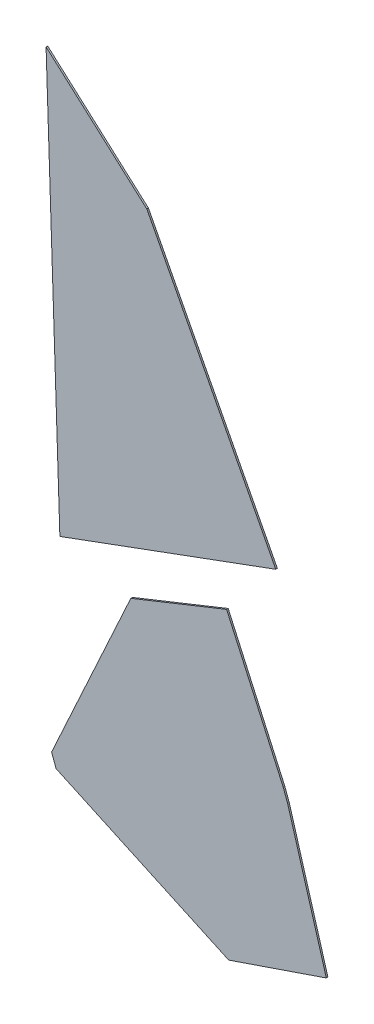
ISO-10303-21;
HEADER;
FILE_DESCRIPTION(('STEP AP214'),'2;1');
FILE_NAME('part.step','',(''),(''),'','','');
FILE_SCHEMA(('AUTOMOTIVE_DESIGN { 1 0 10303 214 1 1 1 1 }'));
ENDSEC;
DATA;
#1=APPLICATION_CONTEXT('core data for automotive mechanical design processes');
#2=APPLICATION_PROTOCOL_DEFINITION('international standard','automotive_design',2000,#1);
#3=PRODUCT_CONTEXT('',#1,'mechanical');
#4=PRODUCT('Part','Part','',(#3));
#5=PRODUCT_RELATED_PRODUCT_CATEGORY('part','',(#4));
#6=PRODUCT_DEFINITION_FORMATION('','',#4);
#7=PRODUCT_DEFINITION_CONTEXT('part definition',#1,'design');
#8=PRODUCT_DEFINITION('design','',#6,#7);
#9=PRODUCT_DEFINITION_SHAPE('','',#8);
#10=(LENGTH_UNIT() NAMED_UNIT(*) SI_UNIT(.MILLI.,.METRE.));
#11=(NAMED_UNIT(*) PLANE_ANGLE_UNIT() SI_UNIT($,.RADIAN.));
#12=(NAMED_UNIT(*) SI_UNIT($,.STERADIAN.) SOLID_ANGLE_UNIT());
#13=UNCERTAINTY_MEASURE_WITH_UNIT(LENGTH_MEASURE(1.E-05),#10,'distance_accuracy_value','');
#14=(GEOMETRIC_REPRESENTATION_CONTEXT(3) GLOBAL_UNCERTAINTY_ASSIGNED_CONTEXT((#13)) GLOBAL_UNIT_ASSIGNED_CONTEXT((#10,
#11,#12)) REPRESENTATION_CONTEXT('',''));
#15=CARTESIAN_POINT('',(0.,0.,0.));
#16=DIRECTION('',(0.,0.,1.));
#17=DIRECTION('',(1.,0.,0.));
#18=AXIS2_PLACEMENT_3D('',#15,#16,#17);
#19=CARTESIAN_POINT('',(35.348767398659,13.6278782738416,0.25));
#20=DIRECTION('',(0.908950021789719,-0.416905094582053,0.));
#21=DIRECTION('',(0.416905094582053,0.908950021789719,0.));
#22=AXIS2_PLACEMENT_3D('',#19,#20,#21);
#23=PLANE('',#22);
#24=DIRECTION('',(-0.416905094582053,-0.908950021789719,0.));
#25=VECTOR('',#24,1.);
#26=CARTESIAN_POINT('',(35.348767398659,13.6278782738416,0.));
#27=LINE('',#26,#25);
#28=CARTESIAN_POINT('',(35.348767398659,13.6278782738416,0.));
#29=VERTEX_POINT('',#28);
#30=CARTESIAN_POINT('',(23.1074874674025,-13.0609576383319,0.));
#31=VERTEX_POINT('',#30);
#32=EDGE_CURVE('E127',#29,#31,#27,.T.);
#33=ORIENTED_EDGE('',*,*,#32,.T.);
#34=DIRECTION('',(0.,0.,-1.));
#35=VECTOR('',#34,1.);
#36=CARTESIAN_POINT('',(23.1074874674025,-13.0609576383319,0.25));
#37=LINE('',#36,#35);
#38=CARTESIAN_POINT('',(23.1074874674025,-13.0609576383319,0.25));
#39=VERTEX_POINT('',#38);
#40=EDGE_CURVE('E12',#39,#31,#37,.T.);
#41=ORIENTED_EDGE('',*,*,#40,.F.);
#42=DIRECTION('',(-0.416905094582053,-0.908950021789719,0.));
#43=VECTOR('',#42,1.);
#44=CARTESIAN_POINT('',(35.348767398659,13.6278782738416,0.25));
#45=LINE('',#44,#43);
#46=CARTESIAN_POINT('',(35.348767398659,13.6278782738416,0.25));
#47=VERTEX_POINT('',#46);
#48=EDGE_CURVE('E89',#47,#39,#45,.T.);
#49=ORIENTED_EDGE('',*,*,#48,.F.);
#50=DIRECTION('',(0.,0.,-1.));
#51=VECTOR('',#50,1.);
#52=CARTESIAN_POINT('',(35.348767398659,13.6278782738416,0.25));
#53=LINE('',#52,#51);
#54=EDGE_CURVE('E168',#47,#29,#53,.T.);
#55=ORIENTED_EDGE('',*,*,#54,.T.);
#56=EDGE_LOOP('',(#33,#41,#49,#55));
#57=FACE_BOUND('',#56,.T.);
#58=ADVANCED_FACE('F47',(#57),#23,.F.);
#59=CARTESIAN_POINT('',(58.8762130793642,0.181757912814679,0.25));
#60=DIRECTION('',(-0.911627072645845,-0.411018345599277,0.));
#61=DIRECTION('',(0.411018345599277,-0.911627072645845,0.));
#62=AXIS2_PLACEMENT_3D('',#59,#60,#61);
#63=PLANE('',#62);
#64=DIRECTION('',(-0.411018345599277,0.911627072645845,0.));
#65=VECTOR('',#64,1.);
#66=CARTESIAN_POINT('',(58.8762130793642,0.181757912814679,0.));
#67=LINE('',#66,#65);
#68=CARTESIAN_POINT('',(58.8762130793642,0.181757912814679,0.));
#69=VERTEX_POINT('',#68);
#70=CARTESIAN_POINT('',(50.1461458372713,19.5448002906597,0.));
#71=VERTEX_POINT('',#70);
#72=EDGE_CURVE('E78',#69,#71,#67,.T.);
#73=ORIENTED_EDGE('',*,*,#72,.T.);
#74=DIRECTION('',(0.,0.,-1.));
#75=VECTOR('',#74,1.);
#76=CARTESIAN_POINT('',(50.1461458372713,19.5448002906597,0.25));
#77=LINE('',#76,#75);
#78=CARTESIAN_POINT('',(50.1461458372713,19.5448002906597,0.25));
#79=VERTEX_POINT('',#78);
#80=EDGE_CURVE('E173',#79,#71,#77,.T.);
#81=ORIENTED_EDGE('',*,*,#80,.F.);
#82=DIRECTION('',(-0.411018345599277,0.911627072645845,0.));
#83=VECTOR('',#82,1.);
#84=CARTESIAN_POINT('',(58.8762130793642,0.181757912814679,0.25));
#85=LINE('',#84,#83);
#86=CARTESIAN_POINT('',(58.8762130793642,0.181757912814679,0.25));
#87=VERTEX_POINT('',#86);
#88=EDGE_CURVE('E165',#87,#79,#85,.T.);
#89=ORIENTED_EDGE('',*,*,#88,.F.);
#90=DIRECTION('',(0.,0.,-1.));
#91=VECTOR('',#90,1.);
#92=CARTESIAN_POINT('',(58.8762130793642,0.181757912814679,0.25));
#93=LINE('',#92,#91);
#94=EDGE_CURVE('E55',#87,#69,#93,.T.);
#95=ORIENTED_EDGE('',*,*,#94,.T.);
#96=EDGE_LOOP('',(#73,#81,#89,#95));
#97=FACE_BOUND('',#96,.T.);
#98=ADVANCED_FACE('F174',(#97),#63,.F.);
#99=CARTESIAN_POINT('',(35.348767398659,13.6278782738416,0.25));
#100=DIRECTION('',(0.371280897715098,-0.928520594812991,0.));
#101=DIRECTION('',(0.928520594812991,0.371280897715098,0.));
#102=AXIS2_PLACEMENT_3D('',#99,#100,#101);
#103=PLANE('',#102);
#104=DIRECTION('',(-0.928520594812991,-0.371280897715098,0.));
#105=VECTOR('',#104,1.);
#106=CARTESIAN_POINT('',(35.348767398659,13.6278782738416,0.));
#107=LINE('',#106,#105);
#108=EDGE_CURVE('E84',#71,#29,#107,.T.);
#109=ORIENTED_EDGE('',*,*,#108,.T.);
#110=ORIENTED_EDGE('',*,*,#54,.F.);
#111=DIRECTION('',(-0.928520594812991,-0.371280897715098,0.));
#112=VECTOR('',#111,1.);
#113=CARTESIAN_POINT('',(35.348767398659,13.6278782738416,0.25));
#114=LINE('',#113,#112);
#115=EDGE_CURVE('E63',#79,#47,#114,.T.);
#116=ORIENTED_EDGE('',*,*,#115,.F.);
#117=ORIENTED_EDGE('',*,*,#80,.T.);
#118=EDGE_LOOP('',(#109,#110,#116,#117));
#119=FACE_BOUND('',#118,.T.);
#120=ADVANCED_FACE('F203',(#119),#103,.F.);
#121=CARTESIAN_POINT('',(0.,0.,0.25));
#122=DIRECTION('',(0.,0.,-1.));
#123=DIRECTION('',(-1.,0.,0.));
#124=AXIS2_PLACEMENT_3D('',#121,#122,#123);
#125=PLANE('',#124);
#126=ORIENTED_EDGE('',*,*,#48,.T.);
#127=DIRECTION('',(0.347199983804975,-0.937791112799554,0.));
#128=VECTOR('',#127,1.);
#129=CARTESIAN_POINT('',(23.1074874674025,-13.0609576383319,0.25));
#130=LINE('',#129,#128);
#131=CARTESIAN_POINT('',(23.8018874350125,-14.936539863931,0.25));
#132=VERTEX_POINT('',#131);
#133=EDGE_CURVE('E160',#39,#132,#130,.T.);
#134=ORIENTED_EDGE('',*,*,#133,.T.);
#135=DIRECTION('',(-0.9083012663516,0.418316637900143,0.));
#136=VECTOR('',#135,1.);
#137=CARTESIAN_POINT('',(50.4716744148795,-27.2192659111414,0.25));
#138=LINE('',#137,#136);
#139=CARTESIAN_POINT('',(50.4716744148795,-27.2192659111414,0.25));
#140=VERTEX_POINT('',#139);
#141=EDGE_CURVE('E147',#140,#132,#138,.T.);
#142=ORIENTED_EDGE('',*,*,#141,.F.);
#143=DIRECTION('',(-0.94643721859255,-0.322887892716339,0.));
#144=VECTOR('',#143,1.);
#145=CARTESIAN_POINT('',(50.4716744148795,-27.2192659111414,0.25));
#146=LINE('',#145,#144);
#147=CARTESIAN_POINT('',(65.5545813209156,-22.073559538595,0.25));
#148=VERTEX_POINT('',#147);
#149=EDGE_CURVE('E156',#148,#140,#146,.T.);
#150=ORIENTED_EDGE('',*,*,#149,.F.);
#151=DIRECTION('',(0.281729873535813,-0.95949376150004,0.));
#152=VECTOR('',#151,1.);
#153=CARTESIAN_POINT('',(59.5706130469742,-1.69382431278441,0.25));
#154=LINE('',#153,#152);
#155=CARTESIAN_POINT('',(59.5706130469742,-1.69382431278441,0.25));
#156=VERTEX_POINT('',#155);
#157=EDGE_CURVE('E176',#156,#148,#154,.T.);
#158=ORIENTED_EDGE('',*,*,#157,.F.);
#159=DIRECTION('',(-0.347199983804977,0.937791112799553,0.));
#160=VECTOR('',#159,1.);
#161=CARTESIAN_POINT('',(59.2234130631692,-0.756033199984865,0.25));
#162=LINE('',#161,#160);
#163=EDGE_CURVE('E134',#156,#87,#162,.T.);
#164=ORIENTED_EDGE('',*,*,#163,.T.);
#165=ORIENTED_EDGE('',*,*,#88,.T.);
#166=ORIENTED_EDGE('',*,*,#115,.T.);
#167=EDGE_LOOP('',(#126,#134,#142,#150,#158,#164,#165,#166));
#168=FACE_BOUND('',#167,.T.);
#169=ADVANCED_FACE('F175',(#168),#125,.F.);
#170=CARTESIAN_POINT('',(0.,0.,0.));
#171=DIRECTION('',(0.,0.,-1.));
#172=DIRECTION('',(-1.,0.,0.));
#173=AXIS2_PLACEMENT_3D('',#170,#171,#172);
#174=PLANE('',#173);
#175=ORIENTED_EDGE('',*,*,#32,.F.);
#176=ORIENTED_EDGE('',*,*,#108,.F.);
#177=ORIENTED_EDGE('',*,*,#72,.F.);
#178=DIRECTION('',(-0.347199983804978,0.937791112799553,0.));
#179=VECTOR('',#178,1.);
#180=CARTESIAN_POINT('',(59.2234130631692,-0.756033199984865,0.));
#181=LINE('',#180,#179);
#182=CARTESIAN_POINT('',(59.5706130469742,-1.69382431278441,0.));
#183=VERTEX_POINT('',#182);
#184=EDGE_CURVE('E119',#183,#69,#181,.T.);
#185=ORIENTED_EDGE('',*,*,#184,.F.);
#186=DIRECTION('',(0.281729873535813,-0.95949376150004,0.));
#187=VECTOR('',#186,1.);
#188=CARTESIAN_POINT('',(59.5706130469742,-1.69382431278441,0.));
#189=LINE('',#188,#187);
#190=CARTESIAN_POINT('',(65.5545813209156,-22.073559538595,0.));
#191=VERTEX_POINT('',#190);
#192=EDGE_CURVE('E124',#183,#191,#189,.T.);
#193=ORIENTED_EDGE('',*,*,#192,.T.);
#194=DIRECTION('',(-0.94643721859255,-0.322887892716339,0.));
#195=VECTOR('',#194,1.);
#196=CARTESIAN_POINT('',(50.4716744148795,-27.2192659111414,0.));
#197=LINE('',#196,#195);
#198=CARTESIAN_POINT('',(50.4716744148795,-27.2192659111414,0.));
#199=VERTEX_POINT('',#198);
#200=EDGE_CURVE('E144',#191,#199,#197,.T.);
#201=ORIENTED_EDGE('',*,*,#200,.T.);
#202=DIRECTION('',(-0.9083012663516,0.418316637900143,0.));
#203=VECTOR('',#202,1.);
#204=CARTESIAN_POINT('',(50.4716744148795,-27.2192659111414,0.));
#205=LINE('',#204,#203);
#206=CARTESIAN_POINT('',(23.8018874350125,-14.936539863931,0.));
#207=VERTEX_POINT('',#206);
#208=EDGE_CURVE('E145',#199,#207,#205,.T.);
#209=ORIENTED_EDGE('',*,*,#208,.T.);
#210=DIRECTION('',(0.347199983804975,-0.937791112799554,0.));
#211=VECTOR('',#210,1.);
#212=CARTESIAN_POINT('',(23.1074874674025,-13.0609576383319,0.));
#213=LINE('',#212,#211);
#214=EDGE_CURVE('E128',#31,#207,#213,.T.);
#215=ORIENTED_EDGE('',*,*,#214,.F.);
#216=EDGE_LOOP('',(#175,#176,#177,#185,#193,#201,#209,#215));
#217=FACE_BOUND('',#216,.T.);
#218=ADVANCED_FACE('F122',(#217),#174,.T.);
#219=CARTESIAN_POINT('',(23.1074874674025,-13.0609576383319,-38.8000882845024));
#220=DIRECTION('',(-0.937791112799554,-0.347199983804975,0.));
#221=DIRECTION('',(0.347199983804975,-0.937791112799554,0.));
#222=AXIS2_PLACEMENT_3D('',#219,#220,#221);
#223=PLANE('',#222);
#224=ORIENTED_EDGE('',*,*,#40,.T.);
#225=ORIENTED_EDGE('',*,*,#214,.T.);
#226=DIRECTION('',(0.,0.,-1.));
#227=VECTOR('',#226,1.);
#228=CARTESIAN_POINT('',(23.8018874350125,-14.936539863931,0.25));
#229=LINE('',#228,#227);
#230=EDGE_CURVE('E138',#132,#207,#229,.T.);
#231=ORIENTED_EDGE('',*,*,#230,.F.);
#232=ORIENTED_EDGE('',*,*,#133,.F.);
#233=EDGE_LOOP('',(#224,#225,#231,#232));
#234=FACE_BOUND('',#233,.T.);
#235=ADVANCED_FACE('F188',(#234),#223,.T.);
#236=CARTESIAN_POINT('',(59.2234130631692,-0.756033199984865,-38.8000882845024));
#237=DIRECTION('',(0.937791112799553,0.347199983804977,0.));
#238=DIRECTION('',(-0.347199983804978,0.937791112799553,0.));
#239=AXIS2_PLACEMENT_3D('',#236,#237,#238);
#240=PLANE('',#239);
#241=ORIENTED_EDGE('',*,*,#163,.F.);
#242=DIRECTION('',(0.,0.,-1.));
#243=VECTOR('',#242,1.);
#244=CARTESIAN_POINT('',(59.5706130469742,-1.69382431278441,0.25));
#245=LINE('',#244,#243);
#246=EDGE_CURVE('E131',#156,#183,#245,.T.);
#247=ORIENTED_EDGE('',*,*,#246,.T.);
#248=ORIENTED_EDGE('',*,*,#184,.T.);
#249=ORIENTED_EDGE('',*,*,#94,.F.);
#250=EDGE_LOOP('',(#241,#247,#248,#249));
#251=FACE_BOUND('',#250,.T.);
#252=ADVANCED_FACE('F132',(#251),#240,.T.);
#253=CARTESIAN_POINT('',(50.4716744148795,-27.2192659111414,0.25));
#254=DIRECTION('',(0.418316637900143,0.9083012663516,0.));
#255=DIRECTION('',(0.9083012663516,-0.418316637900143,0.));
#256=AXIS2_PLACEMENT_3D('',#253,#254,#255);
#257=PLANE('',#256);
#258=ORIENTED_EDGE('',*,*,#208,.F.);
#259=DIRECTION('',(0.,0.,-1.));
#260=VECTOR('',#259,1.);
#261=CARTESIAN_POINT('',(50.4716744148795,-27.2192659111414,0.25));
#262=LINE('',#261,#260);
#263=EDGE_CURVE('E153',#140,#199,#262,.T.);
#264=ORIENTED_EDGE('',*,*,#263,.F.);
#265=ORIENTED_EDGE('',*,*,#141,.T.);
#266=ORIENTED_EDGE('',*,*,#230,.T.);
#267=EDGE_LOOP('',(#258,#264,#265,#266));
#268=FACE_BOUND('',#267,.T.);
#269=ADVANCED_FACE('F184',(#268),#257,.F.);
#270=CARTESIAN_POINT('',(59.5706130469742,-1.69382431278441,0.25));
#271=DIRECTION('',(-0.95949376150004,-0.281729873535813,0.));
#272=DIRECTION('',(-0.281729873535813,0.95949376150004,0.));
#273=AXIS2_PLACEMENT_3D('',#270,#271,#272);
#274=PLANE('',#273);
#275=ORIENTED_EDGE('',*,*,#192,.F.);
#276=ORIENTED_EDGE('',*,*,#246,.F.);
#277=ORIENTED_EDGE('',*,*,#157,.T.);
#278=DIRECTION('',(0.,0.,-1.));
#279=VECTOR('',#278,1.);
#280=CARTESIAN_POINT('',(65.5545813209156,-22.073559538595,0.25));
#281=LINE('',#280,#279);
#282=EDGE_CURVE('E139',#148,#191,#281,.T.);
#283=ORIENTED_EDGE('',*,*,#282,.T.);
#284=EDGE_LOOP('',(#275,#276,#277,#283));
#285=FACE_BOUND('',#284,.T.);
#286=ADVANCED_FACE('F142',(#285),#274,.F.);
#287=CARTESIAN_POINT('',(50.4716744148795,-27.2192659111414,0.25));
#288=DIRECTION('',(-0.322887892716339,0.94643721859255,0.));
#289=DIRECTION('',(0.94643721859255,0.322887892716339,0.));
#290=AXIS2_PLACEMENT_3D('',#287,#288,#289);
#291=PLANE('',#290);
#292=ORIENTED_EDGE('',*,*,#200,.F.);
#293=ORIENTED_EDGE('',*,*,#282,.F.);
#294=ORIENTED_EDGE('',*,*,#149,.T.);
#295=ORIENTED_EDGE('',*,*,#263,.T.);
#296=EDGE_LOOP('',(#292,#293,#294,#295));
#297=FACE_BOUND('',#296,.T.);
#298=ADVANCED_FACE('F191',(#297),#291,.F.);
#299=CLOSED_SHELL('',(#58,#98,#120,#169,#218,#235,#252,#269,#286,#298));
#300=MANIFOLD_SOLID_BREP('B2',#299);
#301=CARTESIAN_POINT('',(24.3893056857729,16.4298781131678,0.25));
#302=DIRECTION('',(0.999452802670967,0.0330771104111027,0.));
#303=DIRECTION('',(-0.0330771104111027,0.999452802670967,0.));
#304=AXIS2_PLACEMENT_3D('',#301,#302,#303);
#305=PLANE('',#304);
#306=DIRECTION('',(0.0330771104111027,-0.999452802670967,0.));
#307=VECTOR('',#306,1.);
#308=CARTESIAN_POINT('',(24.3893056857729,16.4298781131678,0.));
#309=LINE('',#308,#307);
#310=CARTESIAN_POINT('',(22.2567936395397,80.8655290768623,0.));
#311=VERTEX_POINT('',#310);
#312=CARTESIAN_POINT('',(24.3893056857729,16.4298781131678,0.));
#313=VERTEX_POINT('',#312);
#314=EDGE_CURVE('E381',#311,#313,#309,.T.);
#315=ORIENTED_EDGE('',*,*,#314,.T.);
#316=DIRECTION('',(0.,0.,-1.));
#317=VECTOR('',#316,1.);
#318=CARTESIAN_POINT('',(24.3893056857729,16.4298781131678,0.25));
#319=LINE('',#318,#317);
#320=CARTESIAN_POINT('',(24.3893056857729,16.4298781131678,0.25));
#321=VERTEX_POINT('',#320);
#322=EDGE_CURVE('E45',#321,#313,#319,.T.);
#323=ORIENTED_EDGE('',*,*,#322,.F.);
#324=DIRECTION('',(0.0330771104111027,-0.999452802670967,0.));
#325=VECTOR('',#324,1.);
#326=CARTESIAN_POINT('',(24.3893056857729,16.4298781131678,0.25));
#327=LINE('',#326,#325);
#328=CARTESIAN_POINT('',(22.2567936395397,80.8655290768623,0.25));
#329=VERTEX_POINT('',#328);
#330=EDGE_CURVE('E369',#329,#321,#327,.T.);
#331=ORIENTED_EDGE('',*,*,#330,.F.);
#332=DIRECTION('',(0.,0.,-1.));
#333=VECTOR('',#332,1.);
#334=CARTESIAN_POINT('',(22.2567936395397,80.8655290768623,0.25));
#335=LINE('',#334,#333);
#336=EDGE_CURVE('E377',#329,#311,#335,.T.);
#337=ORIENTED_EDGE('',*,*,#336,.T.);
#338=EDGE_LOOP('',(#315,#323,#331,#337));
#339=FACE_BOUND('',#338,.T.);
#340=ADVANCED_FACE('F318',(#339),#305,.F.);
#341=CARTESIAN_POINT('',(24.3893056857729,16.4298781131678,0.25));
#342=DIRECTION('',(-0.345549543443476,0.938400507792918,0.));
#343=DIRECTION('',(-0.938400507792918,-0.345549543443476,0.));
#344=AXIS2_PLACEMENT_3D('',#341,#342,#343);
#345=PLANE('',#344);
#346=DIRECTION('',(0.938400507792918,0.345549543443476,0.));
#347=VECTOR('',#346,1.);
#348=CARTESIAN_POINT('',(24.3893056857729,16.4298781131678,0.));
#349=LINE('',#348,#347);
#350=CARTESIAN_POINT('',(57.7466228673609,28.71312564647,0.));
#351=VERTEX_POINT('',#350);
#352=EDGE_CURVE('E373',#313,#351,#349,.T.);
#353=ORIENTED_EDGE('',*,*,#352,.T.);
#354=DIRECTION('',(0.,0.,-1.));
#355=VECTOR('',#354,1.);
#356=CARTESIAN_POINT('',(57.7466228673609,28.71312564647,0.25));
#357=LINE('',#356,#355);
#358=CARTESIAN_POINT('',(57.7466228673609,28.71312564647,0.25));
#359=VERTEX_POINT('',#358);
#360=EDGE_CURVE('E326',#359,#351,#357,.T.);
#361=ORIENTED_EDGE('',*,*,#360,.F.);
#362=DIRECTION('',(0.938400507792918,0.345549543443476,0.));
#363=VECTOR('',#362,1.);
#364=CARTESIAN_POINT('',(24.3893056857729,16.4298781131678,0.25));
#365=LINE('',#364,#363);
#366=EDGE_CURVE('E364',#321,#359,#365,.T.);
#367=ORIENTED_EDGE('',*,*,#366,.F.);
#368=ORIENTED_EDGE('',*,*,#322,.T.);
#369=EDGE_LOOP('',(#353,#361,#367,#368));
#370=FACE_BOUND('',#369,.T.);
#371=ADVANCED_FACE('F372',(#370),#345,.F.);
#372=CARTESIAN_POINT('',(37.8223667329357,66.9639314789663,0.25));
#373=DIRECTION('',(-0.886895451143001,-0.461970192481997,0.));
#374=DIRECTION('',(0.461970192481997,-0.886895451143001,0.));
#375=AXIS2_PLACEMENT_3D('',#372,#373,#374);
#376=PLANE('',#375);
#377=DIRECTION('',(-0.461970192481997,0.886895451143001,0.));
#378=VECTOR('',#377,1.);
#379=CARTESIAN_POINT('',(37.8223667329357,66.9639314789663,0.));
#380=LINE('',#379,#378);
#381=CARTESIAN_POINT('',(37.8223667329357,66.9639314789663,0.));
#382=VERTEX_POINT('',#381);
#383=EDGE_CURVE('E351',#351,#382,#380,.T.);
#384=ORIENTED_EDGE('',*,*,#383,.T.);
#385=DIRECTION('',(0.,0.,-1.));
#386=VECTOR('',#385,1.);
#387=CARTESIAN_POINT('',(37.8223667329357,66.9639314789663,0.25));
#388=LINE('',#387,#386);
#389=CARTESIAN_POINT('',(37.8223667329357,66.9639314789663,0.25));
#390=VERTEX_POINT('',#389);
#391=EDGE_CURVE('E374',#390,#382,#388,.T.);
#392=ORIENTED_EDGE('',*,*,#391,.F.);
#393=DIRECTION('',(-0.461970192481997,0.886895451143001,0.));
#394=VECTOR('',#393,1.);
#395=CARTESIAN_POINT('',(37.8223667329357,66.9639314789663,0.25));
#396=LINE('',#395,#394);
#397=EDGE_CURVE('E367',#359,#390,#396,.T.);
#398=ORIENTED_EDGE('',*,*,#397,.F.);
#399=ORIENTED_EDGE('',*,*,#360,.T.);
#400=EDGE_LOOP('',(#384,#392,#398,#399));
#401=FACE_BOUND('',#400,.T.);
#402=ADVANCED_FACE('F375',(#401),#376,.F.);
#403=CARTESIAN_POINT('',(22.2567936395397,80.8655290768623,0.25));
#404=DIRECTION('',(-0.666116131255019,-0.745848040610047,0.));
#405=DIRECTION('',(0.745848040610047,-0.666116131255019,0.));
#406=AXIS2_PLACEMENT_3D('',#403,#404,#405);
#407=PLANE('',#406);
#408=DIRECTION('',(-0.745848040610047,0.666116131255019,0.));
#409=VECTOR('',#408,1.);
#410=CARTESIAN_POINT('',(22.2567936395397,80.8655290768623,0.));
#411=LINE('',#410,#409);
#412=EDGE_CURVE('E357',#382,#311,#411,.T.);
#413=ORIENTED_EDGE('',*,*,#412,.T.);
#414=ORIENTED_EDGE('',*,*,#336,.F.);
#415=DIRECTION('',(-0.745848040610047,0.666116131255019,0.));
#416=VECTOR('',#415,1.);
#417=CARTESIAN_POINT('',(22.2567936395397,80.8655290768623,0.25));
#418=LINE('',#417,#416);
#419=EDGE_CURVE('E334',#390,#329,#418,.T.);
#420=ORIENTED_EDGE('',*,*,#419,.F.);
#421=ORIENTED_EDGE('',*,*,#391,.T.);
#422=EDGE_LOOP('',(#413,#414,#420,#421));
#423=FACE_BOUND('',#422,.T.);
#424=ADVANCED_FACE('F388',(#423),#407,.F.);
#425=CARTESIAN_POINT('',(0.,0.,0.25));
#426=DIRECTION('',(0.,0.,-1.));
#427=DIRECTION('',(-1.,0.,0.));
#428=AXIS2_PLACEMENT_3D('',#425,#426,#427);
#429=PLANE('',#428);
#430=ORIENTED_EDGE('',*,*,#330,.T.);
#431=ORIENTED_EDGE('',*,*,#366,.T.);
#432=ORIENTED_EDGE('',*,*,#397,.T.);
#433=ORIENTED_EDGE('',*,*,#419,.T.);
#434=EDGE_LOOP('',(#430,#431,#432,#433));
#435=FACE_BOUND('',#434,.T.);
#436=ADVANCED_FACE('F365',(#435),#429,.F.);
#437=CARTESIAN_POINT('',(0.,0.,0.));
#438=DIRECTION('',(0.,0.,-1.));
#439=DIRECTION('',(-1.,0.,0.));
#440=AXIS2_PLACEMENT_3D('',#437,#438,#439);
#441=PLANE('',#440);
#442=ORIENTED_EDGE('',*,*,#314,.F.);
#443=ORIENTED_EDGE('',*,*,#412,.F.);
#444=ORIENTED_EDGE('',*,*,#383,.F.);
#445=ORIENTED_EDGE('',*,*,#352,.F.);
#446=EDGE_LOOP('',(#442,#443,#444,#445));
#447=FACE_BOUND('',#446,.T.);
#448=ADVANCED_FACE('F391',(#447),#441,.T.);
#449=CLOSED_SHELL('',(#340,#371,#402,#424,#436,#448));
#450=MANIFOLD_SOLID_BREP('B6',#449);
#451=ADVANCED_BREP_SHAPE_REPRESENTATION('',(#18,#300,#450),#14);
#452=SHAPE_DEFINITION_REPRESENTATION(#9,#451);
ENDSEC;
END-ISO-10303-21;
